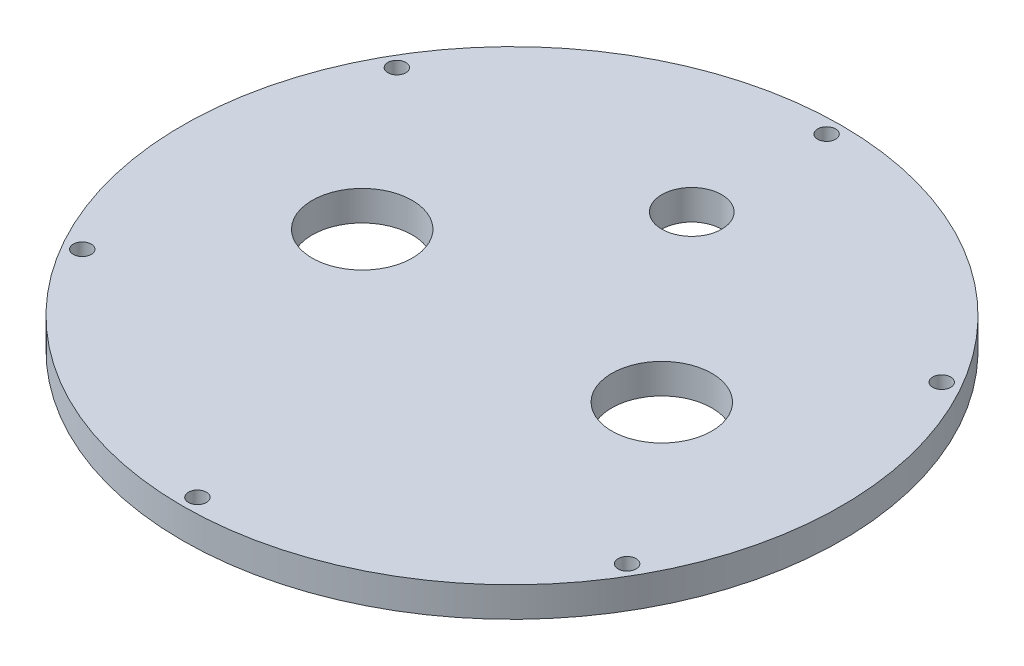
ISO-10303-21;
HEADER;
FILE_DESCRIPTION(('STEP AP214'),'2;1');
FILE_NAME('part.step','',(''),(''),'','','');
FILE_SCHEMA(('AUTOMOTIVE_DESIGN { 1 0 10303 214 1 1 1 1 }'));
ENDSEC;
DATA;
#1=APPLICATION_CONTEXT('core data for automotive mechanical design processes');
#2=APPLICATION_PROTOCOL_DEFINITION('international standard','automotive_design',2000,#1);
#3=PRODUCT_CONTEXT('',#1,'mechanical');
#4=PRODUCT('Part','Part','',(#3));
#5=PRODUCT_RELATED_PRODUCT_CATEGORY('part','',(#4));
#6=PRODUCT_DEFINITION_FORMATION('','',#4);
#7=PRODUCT_DEFINITION_CONTEXT('part definition',#1,'design');
#8=PRODUCT_DEFINITION('design','',#6,#7);
#9=PRODUCT_DEFINITION_SHAPE('','',#8);
#10=(LENGTH_UNIT() NAMED_UNIT(*) SI_UNIT(.MILLI.,.METRE.));
#11=(NAMED_UNIT(*) PLANE_ANGLE_UNIT() SI_UNIT($,.RADIAN.));
#12=(NAMED_UNIT(*) SI_UNIT($,.STERADIAN.) SOLID_ANGLE_UNIT());
#13=UNCERTAINTY_MEASURE_WITH_UNIT(LENGTH_MEASURE(1.E-05),#10,'distance_accuracy_value','');
#14=(GEOMETRIC_REPRESENTATION_CONTEXT(3) GLOBAL_UNCERTAINTY_ASSIGNED_CONTEXT((#13)) GLOBAL_UNIT_ASSIGNED_CONTEXT((#10,
#11,#12)) REPRESENTATION_CONTEXT('',''));
#15=CARTESIAN_POINT('',(0.,0.,0.));
#16=DIRECTION('',(0.,0.,1.));
#17=DIRECTION('',(1.,0.,0.));
#18=AXIS2_PLACEMENT_3D('',#15,#16,#17);
#19=CARTESIAN_POINT('',(0.,5.,0.));
#20=DIRECTION('',(0.,1.,0.));
#21=DIRECTION('',(0.,0.,1.));
#22=AXIS2_PLACEMENT_3D('',#19,#20,#21);
#23=PLANE('',#22);
#24=CARTESIAN_POINT('',(-25.,5.,0.));
#25=DIRECTION('',(0.,-1.,0.));
#26=DIRECTION('',(0.,0.,-1.));
#27=AXIS2_PLACEMENT_3D('',#24,#25,#26);
#28=CIRCLE('',#27,8.35);
#29=CARTESIAN_POINT('',(-25.,5.,-8.35));
#30=VERTEX_POINT('',#29);
#31=EDGE_CURVE('E93',#30,#30,#28,.T.);
#32=ORIENTED_EDGE('',*,*,#31,.T.);
#33=EDGE_LOOP('',(#32));
#34=FACE_BOUND('',#33,.T.);
#35=CARTESIAN_POINT('',(25.,5.,0.));
#36=DIRECTION('',(0.,-1.,0.));
#37=DIRECTION('',(0.,0.,-1.));
#38=AXIS2_PLACEMENT_3D('',#35,#36,#37);
#39=CIRCLE('',#38,8.35);
#40=CARTESIAN_POINT('',(25.,5.,-8.35));
#41=VERTEX_POINT('',#40);
#42=EDGE_CURVE('E94',#41,#41,#39,.T.);
#43=ORIENTED_EDGE('',*,*,#42,.T.);
#44=EDGE_LOOP('',(#43));
#45=FACE_BOUND('',#44,.T.);
#46=CARTESIAN_POINT('',(0.,5.,-30.));
#47=DIRECTION('',(0.,1.,0.));
#48=DIRECTION('',(0.,0.,1.));
#49=AXIS2_PLACEMENT_3D('',#46,#47,#48);
#50=CIRCLE('',#49,5.);
#51=CARTESIAN_POINT('',(0.,5.,-25.));
#52=VERTEX_POINT('',#51);
#53=EDGE_CURVE('E90',#52,#52,#50,.T.);
#54=ORIENTED_EDGE('',*,*,#53,.F.);
#55=EDGE_LOOP('',(#54));
#56=FACE_BOUND('',#55,.T.);
#57=CARTESIAN_POINT('',(-45.466333698683,5.,26.25));
#58=DIRECTION('',(0.,1.,0.));
#59=DIRECTION('',(0.,0.,1.));
#60=AXIS2_PLACEMENT_3D('',#57,#58,#59);
#61=CIRCLE('',#60,1.5);
#62=CARTESIAN_POINT('',(-45.466333698683,5.,27.75));
#63=VERTEX_POINT('',#62);
#64=EDGE_CURVE('E76',#63,#63,#61,.T.);
#65=ORIENTED_EDGE('',*,*,#64,.F.);
#66=EDGE_LOOP('',(#65));
#67=FACE_BOUND('',#66,.T.);
#68=CARTESIAN_POINT('',(45.466333698683,5.,26.25));
#69=DIRECTION('',(0.,1.,0.));
#70=DIRECTION('',(0.,0.,1.));
#71=AXIS2_PLACEMENT_3D('',#68,#69,#70);
#72=CIRCLE('',#71,1.5);
#73=CARTESIAN_POINT('',(45.466333698683,5.,27.75));
#74=VERTEX_POINT('',#73);
#75=EDGE_CURVE('E64',#74,#74,#72,.T.);
#76=ORIENTED_EDGE('',*,*,#75,.F.);
#77=EDGE_LOOP('',(#76));
#78=FACE_BOUND('',#77,.T.);
#79=CARTESIAN_POINT('',(0.,5.,-52.5));
#80=DIRECTION('',(0.,1.,0.));
#81=DIRECTION('',(0.,0.,1.));
#82=AXIS2_PLACEMENT_3D('',#79,#80,#81);
#83=CIRCLE('',#82,1.5);
#84=CARTESIAN_POINT('',(0.,5.,-51.));
#85=VERTEX_POINT('',#84);
#86=EDGE_CURVE('E53',#85,#85,#83,.T.);
#87=ORIENTED_EDGE('',*,*,#86,.F.);
#88=EDGE_LOOP('',(#87));
#89=FACE_BOUND('',#88,.T.);
#90=CARTESIAN_POINT('',(0.,5.,0.));
#91=DIRECTION('',(0.,1.,0.));
#92=DIRECTION('',(0.,0.,1.));
#93=AXIS2_PLACEMENT_3D('',#90,#91,#92);
#94=CIRCLE('',#93,55.);
#95=CARTESIAN_POINT('',(0.,5.,55.));
#96=VERTEX_POINT('',#95);
#97=EDGE_CURVE('E10',#96,#96,#94,.T.);
#98=ORIENTED_EDGE('',*,*,#97,.T.);
#99=EDGE_LOOP('',(#98));
#100=FACE_BOUND('',#99,.T.);
#101=CARTESIAN_POINT('',(45.466333698683,5.,-26.25));
#102=DIRECTION('',(0.,1.,0.));
#103=DIRECTION('',(0.,0.,1.));
#104=AXIS2_PLACEMENT_3D('',#101,#102,#103);
#105=CIRCLE('',#104,1.5);
#106=CARTESIAN_POINT('',(45.466333698683,5.,-24.75));
#107=VERTEX_POINT('',#106);
#108=EDGE_CURVE('E58',#107,#107,#105,.T.);
#109=ORIENTED_EDGE('',*,*,#108,.F.);
#110=EDGE_LOOP('',(#109));
#111=FACE_BOUND('',#110,.T.);
#112=CARTESIAN_POINT('',(0.,5.,52.5));
#113=DIRECTION('',(0.,1.,0.));
#114=DIRECTION('',(0.,0.,1.));
#115=AXIS2_PLACEMENT_3D('',#112,#113,#114);
#116=CIRCLE('',#115,1.5);
#117=CARTESIAN_POINT('',(0.,5.,54.));
#118=VERTEX_POINT('',#117);
#119=EDGE_CURVE('E70',#118,#118,#116,.T.);
#120=ORIENTED_EDGE('',*,*,#119,.F.);
#121=EDGE_LOOP('',(#120));
#122=FACE_BOUND('',#121,.T.);
#123=CARTESIAN_POINT('',(-45.466333698683,5.,-26.25));
#124=DIRECTION('',(0.,1.,0.));
#125=DIRECTION('',(0.,0.,1.));
#126=AXIS2_PLACEMENT_3D('',#123,#124,#125);
#127=CIRCLE('',#126,1.5);
#128=CARTESIAN_POINT('',(-45.466333698683,5.,-24.75));
#129=VERTEX_POINT('',#128);
#130=EDGE_CURVE('E82',#129,#129,#127,.T.);
#131=ORIENTED_EDGE('',*,*,#130,.F.);
#132=EDGE_LOOP('',(#131));
#133=FACE_BOUND('',#132,.T.);
#134=ADVANCED_FACE('F40',(#34,#45,#56,#67,#78,#89,#100,#111,#122,#133),#23,.T.);
#135=CARTESIAN_POINT('',(0.,0.,0.));
#136=DIRECTION('',(0.,1.,0.));
#137=DIRECTION('',(0.,0.,1.));
#138=AXIS2_PLACEMENT_3D('',#135,#136,#137);
#139=PLANE('',#138);
#140=CARTESIAN_POINT('',(-25.,0.,0.));
#141=DIRECTION('',(0.,-1.,0.));
#142=DIRECTION('',(0.,0.,-1.));
#143=AXIS2_PLACEMENT_3D('',#140,#141,#142);
#144=CIRCLE('',#143,8.35);
#145=CARTESIAN_POINT('',(-25.,0.,-8.35));
#146=VERTEX_POINT('',#145);
#147=EDGE_CURVE('E100',#146,#146,#144,.T.);
#148=ORIENTED_EDGE('',*,*,#147,.F.);
#149=EDGE_LOOP('',(#148));
#150=FACE_BOUND('',#149,.T.);
#151=CARTESIAN_POINT('',(25.,0.,0.));
#152=DIRECTION('',(0.,-1.,0.));
#153=DIRECTION('',(0.,0.,-1.));
#154=AXIS2_PLACEMENT_3D('',#151,#152,#153);
#155=CIRCLE('',#154,8.35);
#156=CARTESIAN_POINT('',(25.,0.,-8.35));
#157=VERTEX_POINT('',#156);
#158=EDGE_CURVE('E97',#157,#157,#155,.T.);
#159=ORIENTED_EDGE('',*,*,#158,.F.);
#160=EDGE_LOOP('',(#159));
#161=FACE_BOUND('',#160,.T.);
#162=CARTESIAN_POINT('',(0.,0.,-30.));
#163=DIRECTION('',(0.,1.,0.));
#164=DIRECTION('',(0.,0.,1.));
#165=AXIS2_PLACEMENT_3D('',#162,#163,#164);
#166=CIRCLE('',#165,5.);
#167=CARTESIAN_POINT('',(0.,0.,-25.));
#168=VERTEX_POINT('',#167);
#169=EDGE_CURVE('E44',#168,#168,#166,.T.);
#170=ORIENTED_EDGE('',*,*,#169,.T.);
#171=EDGE_LOOP('',(#170));
#172=FACE_BOUND('',#171,.T.);
#173=CARTESIAN_POINT('',(0.,0.,0.));
#174=DIRECTION('',(0.,1.,0.));
#175=DIRECTION('',(0.,0.,1.));
#176=AXIS2_PLACEMENT_3D('',#173,#174,#175);
#177=CIRCLE('',#176,55.);
#178=CARTESIAN_POINT('',(0.,0.,55.));
#179=VERTEX_POINT('',#178);
#180=EDGE_CURVE('E48',#179,#179,#177,.T.);
#181=ORIENTED_EDGE('',*,*,#180,.F.);
#182=EDGE_LOOP('',(#181));
#183=FACE_BOUND('',#182,.T.);
#184=CARTESIAN_POINT('',(0.,0.,-52.5));
#185=DIRECTION('',(0.,1.,0.));
#186=DIRECTION('',(0.,0.,1.));
#187=AXIS2_PLACEMENT_3D('',#184,#185,#186);
#188=CIRCLE('',#187,1.5);
#189=CARTESIAN_POINT('',(0.,0.,-51.));
#190=VERTEX_POINT('',#189);
#191=EDGE_CURVE('E55',#190,#190,#188,.T.);
#192=ORIENTED_EDGE('',*,*,#191,.T.);
#193=EDGE_LOOP('',(#192));
#194=FACE_BOUND('',#193,.T.);
#195=CARTESIAN_POINT('',(45.466333698683,0.,-26.25));
#196=DIRECTION('',(0.,1.,0.));
#197=DIRECTION('',(0.,0.,1.));
#198=AXIS2_PLACEMENT_3D('',#195,#196,#197);
#199=CIRCLE('',#198,1.5);
#200=CARTESIAN_POINT('',(45.466333698683,0.,-24.75));
#201=VERTEX_POINT('',#200);
#202=EDGE_CURVE('E61',#201,#201,#199,.T.);
#203=ORIENTED_EDGE('',*,*,#202,.T.);
#204=EDGE_LOOP('',(#203));
#205=FACE_BOUND('',#204,.T.);
#206=CARTESIAN_POINT('',(45.466333698683,0.,26.25));
#207=DIRECTION('',(0.,1.,0.));
#208=DIRECTION('',(0.,0.,1.));
#209=AXIS2_PLACEMENT_3D('',#206,#207,#208);
#210=CIRCLE('',#209,1.5);
#211=CARTESIAN_POINT('',(45.466333698683,0.,27.75));
#212=VERTEX_POINT('',#211);
#213=EDGE_CURVE('E67',#212,#212,#210,.T.);
#214=ORIENTED_EDGE('',*,*,#213,.T.);
#215=EDGE_LOOP('',(#214));
#216=FACE_BOUND('',#215,.T.);
#217=CARTESIAN_POINT('',(0.,0.,52.5));
#218=DIRECTION('',(0.,1.,0.));
#219=DIRECTION('',(0.,0.,1.));
#220=AXIS2_PLACEMENT_3D('',#217,#218,#219);
#221=CIRCLE('',#220,1.5);
#222=CARTESIAN_POINT('',(0.,0.,54.));
#223=VERTEX_POINT('',#222);
#224=EDGE_CURVE('E73',#223,#223,#221,.T.);
#225=ORIENTED_EDGE('',*,*,#224,.T.);
#226=EDGE_LOOP('',(#225));
#227=FACE_BOUND('',#226,.T.);
#228=CARTESIAN_POINT('',(-45.466333698683,0.,26.25));
#229=DIRECTION('',(0.,1.,0.));
#230=DIRECTION('',(0.,0.,1.));
#231=AXIS2_PLACEMENT_3D('',#228,#229,#230);
#232=CIRCLE('',#231,1.5);
#233=CARTESIAN_POINT('',(-45.466333698683,0.,27.75));
#234=VERTEX_POINT('',#233);
#235=EDGE_CURVE('E79',#234,#234,#232,.T.);
#236=ORIENTED_EDGE('',*,*,#235,.T.);
#237=EDGE_LOOP('',(#236));
#238=FACE_BOUND('',#237,.T.);
#239=CARTESIAN_POINT('',(-45.466333698683,0.,-26.25));
#240=DIRECTION('',(0.,1.,0.));
#241=DIRECTION('',(0.,0.,1.));
#242=AXIS2_PLACEMENT_3D('',#239,#240,#241);
#243=CIRCLE('',#242,1.5);
#244=CARTESIAN_POINT('',(-45.466333698683,0.,-24.75));
#245=VERTEX_POINT('',#244);
#246=EDGE_CURVE('E85',#245,#245,#243,.T.);
#247=ORIENTED_EDGE('',*,*,#246,.T.);
#248=EDGE_LOOP('',(#247));
#249=FACE_BOUND('',#248,.T.);
#250=ADVANCED_FACE('F115',(#150,#161,#172,#183,#194,#205,#216,#227,#238,#249),#139,.F.);
#251=CARTESIAN_POINT('',(0.,5.,0.));
#252=DIRECTION('',(0.,-1.,0.));
#253=DIRECTION('',(0.,0.,-1.));
#254=AXIS2_PLACEMENT_3D('',#251,#252,#253);
#255=CYLINDRICAL_SURFACE('',#254,55.);
#256=ORIENTED_EDGE('',*,*,#97,.F.);
#257=EDGE_LOOP('',(#256));
#258=FACE_BOUND('',#257,.T.);
#259=ORIENTED_EDGE('',*,*,#180,.T.);
#260=EDGE_LOOP('',(#259));
#261=FACE_BOUND('',#260,.T.);
#262=ADVANCED_FACE('F42',(#258,#261),#255,.T.);
#263=CARTESIAN_POINT('',(0.,5.,-52.5));
#264=DIRECTION('',(0.,-1.,0.));
#265=DIRECTION('',(0.,0.,-1.));
#266=AXIS2_PLACEMENT_3D('',#263,#264,#265);
#267=CYLINDRICAL_SURFACE('',#266,1.5);
#268=ORIENTED_EDGE('',*,*,#86,.T.);
#269=EDGE_LOOP('',(#268));
#270=FACE_BOUND('',#269,.T.);
#271=ORIENTED_EDGE('',*,*,#191,.F.);
#272=EDGE_LOOP('',(#271));
#273=FACE_BOUND('',#272,.T.);
#274=ADVANCED_FACE('F157',(#270,#273),#267,.F.);
#275=CARTESIAN_POINT('',(45.466333698683,5.,-26.25));
#276=DIRECTION('',(0.,-1.,0.));
#277=DIRECTION('',(0.,0.,-1.));
#278=AXIS2_PLACEMENT_3D('',#275,#276,#277);
#279=CYLINDRICAL_SURFACE('',#278,1.5);
#280=ORIENTED_EDGE('',*,*,#108,.T.);
#281=EDGE_LOOP('',(#280));
#282=FACE_BOUND('',#281,.T.);
#283=ORIENTED_EDGE('',*,*,#202,.F.);
#284=EDGE_LOOP('',(#283));
#285=FACE_BOUND('',#284,.T.);
#286=ADVANCED_FACE('F160',(#282,#285),#279,.F.);
#287=CARTESIAN_POINT('',(45.466333698683,5.,26.25));
#288=DIRECTION('',(0.,-1.,0.));
#289=DIRECTION('',(0.,0.,-1.));
#290=AXIS2_PLACEMENT_3D('',#287,#288,#289);
#291=CYLINDRICAL_SURFACE('',#290,1.5);
#292=ORIENTED_EDGE('',*,*,#75,.T.);
#293=EDGE_LOOP('',(#292));
#294=FACE_BOUND('',#293,.T.);
#295=ORIENTED_EDGE('',*,*,#213,.F.);
#296=EDGE_LOOP('',(#295));
#297=FACE_BOUND('',#296,.T.);
#298=ADVANCED_FACE('F164',(#294,#297),#291,.F.);
#299=CARTESIAN_POINT('',(0.,5.,52.5));
#300=DIRECTION('',(0.,-1.,0.));
#301=DIRECTION('',(0.,0.,-1.));
#302=AXIS2_PLACEMENT_3D('',#299,#300,#301);
#303=CYLINDRICAL_SURFACE('',#302,1.5);
#304=ORIENTED_EDGE('',*,*,#119,.T.);
#305=EDGE_LOOP('',(#304));
#306=FACE_BOUND('',#305,.T.);
#307=ORIENTED_EDGE('',*,*,#224,.F.);
#308=EDGE_LOOP('',(#307));
#309=FACE_BOUND('',#308,.T.);
#310=ADVANCED_FACE('F149',(#306,#309),#303,.F.);
#311=CARTESIAN_POINT('',(-45.466333698683,5.,26.25));
#312=DIRECTION('',(0.,-1.,0.));
#313=DIRECTION('',(0.,0.,-1.));
#314=AXIS2_PLACEMENT_3D('',#311,#312,#313);
#315=CYLINDRICAL_SURFACE('',#314,1.5);
#316=ORIENTED_EDGE('',*,*,#64,.T.);
#317=EDGE_LOOP('',(#316));
#318=FACE_BOUND('',#317,.T.);
#319=ORIENTED_EDGE('',*,*,#235,.F.);
#320=EDGE_LOOP('',(#319));
#321=FACE_BOUND('',#320,.T.);
#322=ADVANCED_FACE('F140',(#318,#321),#315,.F.);
#323=CARTESIAN_POINT('',(-45.466333698683,5.,-26.25));
#324=DIRECTION('',(0.,-1.,0.));
#325=DIRECTION('',(0.,0.,-1.));
#326=AXIS2_PLACEMENT_3D('',#323,#324,#325);
#327=CYLINDRICAL_SURFACE('',#326,1.5);
#328=ORIENTED_EDGE('',*,*,#130,.T.);
#329=EDGE_LOOP('',(#328));
#330=FACE_BOUND('',#329,.T.);
#331=ORIENTED_EDGE('',*,*,#246,.F.);
#332=EDGE_LOOP('',(#331));
#333=FACE_BOUND('',#332,.T.);
#334=ADVANCED_FACE('F137',(#330,#333),#327,.F.);
#335=CARTESIAN_POINT('',(0.,-5.,-30.));
#336=DIRECTION('',(0.,1.,0.));
#337=DIRECTION('',(0.,0.,1.));
#338=AXIS2_PLACEMENT_3D('',#335,#336,#337);
#339=CYLINDRICAL_SURFACE('',#338,5.);
#340=ORIENTED_EDGE('',*,*,#53,.T.);
#341=EDGE_LOOP('',(#340));
#342=FACE_BOUND('',#341,.T.);
#343=ORIENTED_EDGE('',*,*,#169,.F.);
#344=EDGE_LOOP('',(#343));
#345=FACE_BOUND('',#344,.T.);
#346=ADVANCED_FACE('F139',(#342,#345),#339,.F.);
#347=CARTESIAN_POINT('',(25.,5.,0.));
#348=DIRECTION('',(0.,-1.,0.));
#349=DIRECTION('',(0.,0.,-1.));
#350=AXIS2_PLACEMENT_3D('',#347,#348,#349);
#351=CYLINDRICAL_SURFACE('',#350,8.35);
#352=ORIENTED_EDGE('',*,*,#42,.F.);
#353=EDGE_LOOP('',(#352));
#354=FACE_BOUND('',#353,.T.);
#355=ORIENTED_EDGE('',*,*,#158,.T.);
#356=EDGE_LOOP('',(#355));
#357=FACE_BOUND('',#356,.T.);
#358=ADVANCED_FACE('F111',(#354,#357),#351,.F.);
#359=CARTESIAN_POINT('',(-25.,5.,0.));
#360=DIRECTION('',(0.,-1.,0.));
#361=DIRECTION('',(0.,0.,-1.));
#362=AXIS2_PLACEMENT_3D('',#359,#360,#361);
#363=CYLINDRICAL_SURFACE('',#362,8.35);
#364=ORIENTED_EDGE('',*,*,#31,.F.);
#365=EDGE_LOOP('',(#364));
#366=FACE_BOUND('',#365,.T.);
#367=ORIENTED_EDGE('',*,*,#147,.T.);
#368=EDGE_LOOP('',(#367));
#369=FACE_BOUND('',#368,.T.);
#370=ADVANCED_FACE('F108',(#366,#369),#363,.F.);
#371=CLOSED_SHELL('',(#134,#250,#262,#274,#286,#298,#310,#322,#334,#346,#358,#370));
#372=MANIFOLD_SOLID_BREP('B2',#371);
#373=ADVANCED_BREP_SHAPE_REPRESENTATION('',(#18,#372),#14);
#374=SHAPE_DEFINITION_REPRESENTATION(#9,#373);
ENDSEC;
END-ISO-10303-21;
